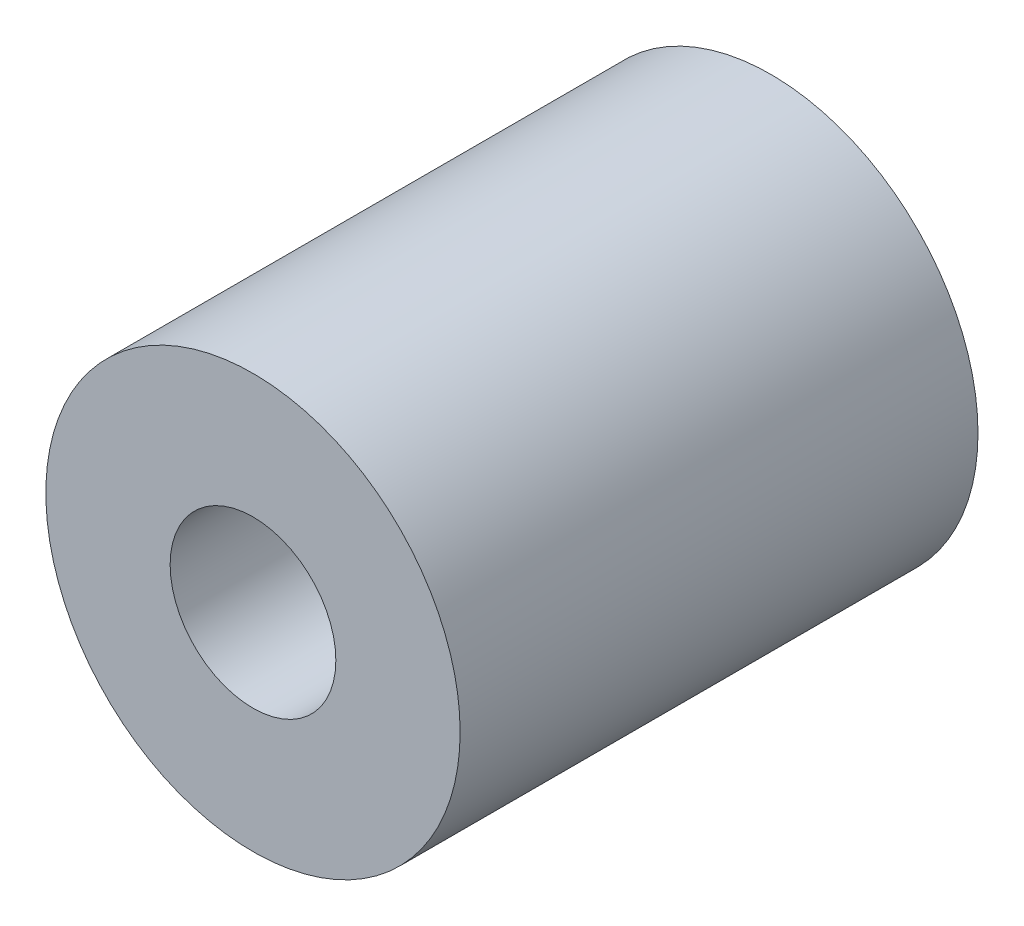
ISO-10303-21;
HEADER;
FILE_DESCRIPTION(('STEP AP214'),'2;1');
FILE_NAME('part.step','',(''),(''),'','','');
FILE_SCHEMA(('AUTOMOTIVE_DESIGN { 1 0 10303 214 1 1 1 1 }'));
ENDSEC;
DATA;
#1=APPLICATION_CONTEXT('core data for automotive mechanical design processes');
#2=APPLICATION_PROTOCOL_DEFINITION('international standard','automotive_design',2000,#1);
#3=PRODUCT_CONTEXT('',#1,'mechanical');
#4=PRODUCT('Part','Part','',(#3));
#5=PRODUCT_RELATED_PRODUCT_CATEGORY('part','',(#4));
#6=PRODUCT_DEFINITION_FORMATION('','',#4);
#7=PRODUCT_DEFINITION_CONTEXT('part definition',#1,'design');
#8=PRODUCT_DEFINITION('design','',#6,#7);
#9=PRODUCT_DEFINITION_SHAPE('','',#8);
#10=(LENGTH_UNIT() NAMED_UNIT(*) SI_UNIT(.MILLI.,.METRE.));
#11=(NAMED_UNIT(*) PLANE_ANGLE_UNIT() SI_UNIT($,.RADIAN.));
#12=(NAMED_UNIT(*) SI_UNIT($,.STERADIAN.) SOLID_ANGLE_UNIT());
#13=UNCERTAINTY_MEASURE_WITH_UNIT(LENGTH_MEASURE(1.E-05),#10,'distance_accuracy_value','');
#14=(GEOMETRIC_REPRESENTATION_CONTEXT(3) GLOBAL_UNCERTAINTY_ASSIGNED_CONTEXT((#13)) GLOBAL_UNIT_ASSIGNED_CONTEXT((#10,
#11,#12)) REPRESENTATION_CONTEXT('',''));
#15=CARTESIAN_POINT('',(0.,0.,0.));
#16=DIRECTION('',(0.,0.,1.));
#17=DIRECTION('',(1.,0.,0.));
#18=AXIS2_PLACEMENT_3D('',#15,#16,#17);
#19=CARTESIAN_POINT('',(0.,0.,10.));
#20=DIRECTION('',(0.,0.,1.));
#21=DIRECTION('',(1.,0.,0.));
#22=AXIS2_PLACEMENT_3D('',#19,#20,#21);
#23=PLANE('',#22);
#24=CARTESIAN_POINT('',(0.,0.,10.));
#25=DIRECTION('',(0.,0.,1.));
#26=DIRECTION('',(1.,0.,0.));
#27=AXIS2_PLACEMENT_3D('',#24,#25,#26);
#28=CIRCLE('',#27,4.);
#29=CARTESIAN_POINT('',(4.,0.,10.));
#30=VERTEX_POINT('',#29);
#31=EDGE_CURVE('E10',#30,#30,#28,.T.);
#32=ORIENTED_EDGE('',*,*,#31,.T.);
#33=EDGE_LOOP('',(#32));
#34=FACE_BOUND('',#33,.T.);
#35=CARTESIAN_POINT('',(0.,0.,10.));
#36=DIRECTION('',(0.,0.,1.));
#37=DIRECTION('',(1.,0.,0.));
#38=AXIS2_PLACEMENT_3D('',#35,#36,#37);
#39=CIRCLE('',#38,1.6);
#40=CARTESIAN_POINT('',(1.6,0.,10.));
#41=VERTEX_POINT('',#40);
#42=EDGE_CURVE('E50',#41,#41,#39,.T.);
#43=ORIENTED_EDGE('',*,*,#42,.F.);
#44=EDGE_LOOP('',(#43));
#45=FACE_BOUND('',#44,.T.);
#46=ADVANCED_FACE('F37',(#34,#45),#23,.T.);
#47=CARTESIAN_POINT('',(0.,0.,0.));
#48=DIRECTION('',(0.,0.,1.));
#49=DIRECTION('',(1.,0.,0.));
#50=AXIS2_PLACEMENT_3D('',#47,#48,#49);
#51=PLANE('',#50);
#52=CARTESIAN_POINT('',(0.,0.,0.));
#53=DIRECTION('',(0.,0.,1.));
#54=DIRECTION('',(1.,0.,0.));
#55=AXIS2_PLACEMENT_3D('',#52,#53,#54);
#56=CIRCLE('',#55,4.);
#57=CARTESIAN_POINT('',(4.,0.,0.));
#58=VERTEX_POINT('',#57);
#59=EDGE_CURVE('E41',#58,#58,#56,.T.);
#60=ORIENTED_EDGE('',*,*,#59,.F.);
#61=EDGE_LOOP('',(#60));
#62=FACE_BOUND('',#61,.T.);
#63=CARTESIAN_POINT('',(0.,0.,0.));
#64=DIRECTION('',(0.,0.,1.));
#65=DIRECTION('',(1.,0.,0.));
#66=AXIS2_PLACEMENT_3D('',#63,#64,#65);
#67=CIRCLE('',#66,1.6);
#68=CARTESIAN_POINT('',(1.6,0.,0.));
#69=VERTEX_POINT('',#68);
#70=EDGE_CURVE('E52',#69,#69,#67,.T.);
#71=ORIENTED_EDGE('',*,*,#70,.T.);
#72=EDGE_LOOP('',(#71));
#73=FACE_BOUND('',#72,.T.);
#74=ADVANCED_FACE('F64',(#62,#73),#51,.F.);
#75=CARTESIAN_POINT('',(0.,0.,10.));
#76=DIRECTION('',(0.,0.,-1.));
#77=DIRECTION('',(-1.,0.,0.));
#78=AXIS2_PLACEMENT_3D('',#75,#76,#77);
#79=CYLINDRICAL_SURFACE('',#78,4.);
#80=ORIENTED_EDGE('',*,*,#31,.F.);
#81=EDGE_LOOP('',(#80));
#82=FACE_BOUND('',#81,.T.);
#83=ORIENTED_EDGE('',*,*,#59,.T.);
#84=EDGE_LOOP('',(#83));
#85=FACE_BOUND('',#84,.T.);
#86=ADVANCED_FACE('F39',(#82,#85),#79,.T.);
#87=CARTESIAN_POINT('',(0.,0.,10.));
#88=DIRECTION('',(0.,0.,-1.));
#89=DIRECTION('',(-1.,0.,0.));
#90=AXIS2_PLACEMENT_3D('',#87,#88,#89);
#91=CYLINDRICAL_SURFACE('',#90,1.6);
#92=ORIENTED_EDGE('',*,*,#42,.T.);
#93=EDGE_LOOP('',(#92));
#94=FACE_BOUND('',#93,.T.);
#95=ORIENTED_EDGE('',*,*,#70,.F.);
#96=EDGE_LOOP('',(#95));
#97=FACE_BOUND('',#96,.T.);
#98=ADVANCED_FACE('F60',(#94,#97),#91,.F.);
#99=CLOSED_SHELL('',(#46,#74,#86,#98));
#100=MANIFOLD_SOLID_BREP('B2',#99);
#101=ADVANCED_BREP_SHAPE_REPRESENTATION('',(#18,#100),#14);
#102=SHAPE_DEFINITION_REPRESENTATION(#9,#101);
ENDSEC;
END-ISO-10303-21;
